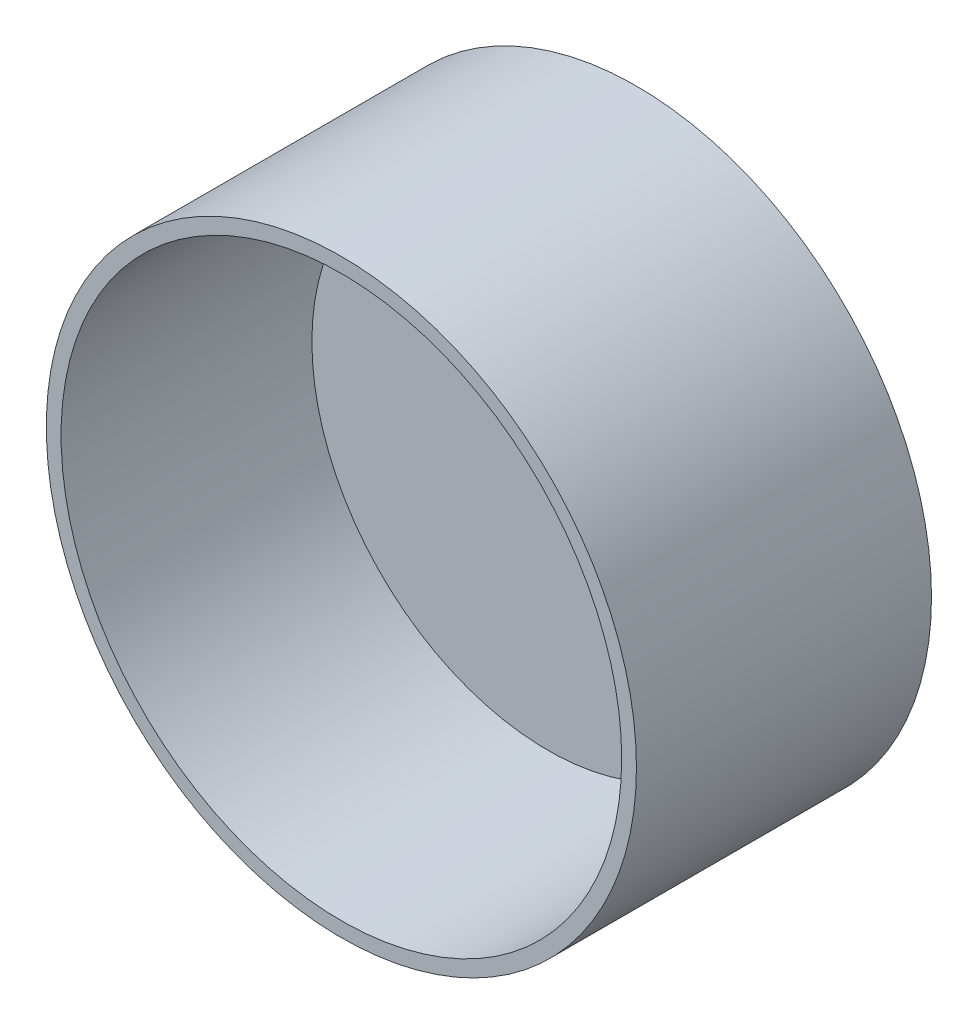
ISO-10303-21;
HEADER;
FILE_DESCRIPTION(('STEP AP214'),'2;1');
FILE_NAME('part.step','',(''),(''),'','','');
FILE_SCHEMA(('AUTOMOTIVE_DESIGN { 1 0 10303 214 1 1 1 1 }'));
ENDSEC;
DATA;
#1=APPLICATION_CONTEXT('core data for automotive mechanical design processes');
#2=APPLICATION_PROTOCOL_DEFINITION('international standard','automotive_design',2000,#1);
#3=PRODUCT_CONTEXT('',#1,'mechanical');
#4=PRODUCT('Part','Part','',(#3));
#5=PRODUCT_RELATED_PRODUCT_CATEGORY('part','',(#4));
#6=PRODUCT_DEFINITION_FORMATION('','',#4);
#7=PRODUCT_DEFINITION_CONTEXT('part definition',#1,'design');
#8=PRODUCT_DEFINITION('design','',#6,#7);
#9=PRODUCT_DEFINITION_SHAPE('','',#8);
#10=(LENGTH_UNIT() NAMED_UNIT(*) SI_UNIT(.MILLI.,.METRE.));
#11=(NAMED_UNIT(*) PLANE_ANGLE_UNIT() SI_UNIT($,.RADIAN.));
#12=(NAMED_UNIT(*) SI_UNIT($,.STERADIAN.) SOLID_ANGLE_UNIT());
#13=UNCERTAINTY_MEASURE_WITH_UNIT(LENGTH_MEASURE(1.E-05),#10,'distance_accuracy_value','');
#14=(GEOMETRIC_REPRESENTATION_CONTEXT(3) GLOBAL_UNCERTAINTY_ASSIGNED_CONTEXT((#13)) GLOBAL_UNIT_ASSIGNED_CONTEXT((#10,
#11,#12)) REPRESENTATION_CONTEXT('',''));
#15=CARTESIAN_POINT('',(0.,0.,0.));
#16=DIRECTION('',(0.,0.,1.));
#17=DIRECTION('',(1.,0.,0.));
#18=AXIS2_PLACEMENT_3D('',#15,#16,#17);
#19=CARTESIAN_POINT('',(0.,0.,30.));
#20=DIRECTION('',(0.,0.,-1.));
#21=DIRECTION('',(-1.,0.,0.));
#22=AXIS2_PLACEMENT_3D('',#19,#20,#21);
#23=CYLINDRICAL_SURFACE('',#22,80.);
#24=CARTESIAN_POINT('',(0.,0.,30.));
#25=DIRECTION('',(0.,0.,-1.));
#26=DIRECTION('',(-1.,0.,0.));
#27=AXIS2_PLACEMENT_3D('',#24,#25,#26);
#28=CIRCLE('',#27,80.);
#29=CARTESIAN_POINT('',(-80.,0.,30.));
#30=VERTEX_POINT('',#29);
#31=EDGE_CURVE('E11',#30,#30,#28,.T.);
#32=ORIENTED_EDGE('',*,*,#31,.T.);
#33=EDGE_LOOP('',(#32));
#34=FACE_BOUND('',#33,.T.);
#35=CARTESIAN_POINT('',(0.,0.,0.));
#36=DIRECTION('',(0.,0.,-1.));
#37=DIRECTION('',(-1.,0.,0.));
#38=AXIS2_PLACEMENT_3D('',#35,#36,#37);
#39=CIRCLE('',#38,80.);
#40=CARTESIAN_POINT('',(-80.,0.,0.));
#41=VERTEX_POINT('',#40);
#42=EDGE_CURVE('E49',#41,#41,#39,.T.);
#43=ORIENTED_EDGE('',*,*,#42,.F.);
#44=EDGE_LOOP('',(#43));
#45=FACE_BOUND('',#44,.T.);
#46=ADVANCED_FACE('F46',(#34,#45),#23,.T.);
#47=CARTESIAN_POINT('',(0.,0.,30.));
#48=DIRECTION('',(0.,0.,-1.));
#49=DIRECTION('',(-1.,0.,0.));
#50=AXIS2_PLACEMENT_3D('',#47,#48,#49);
#51=PLANE('',#50);
#52=ORIENTED_EDGE('',*,*,#31,.F.);
#53=EDGE_LOOP('',(#52));
#54=FACE_BOUND('',#53,.T.);
#55=ADVANCED_FACE('F61',(#54),#51,.F.);
#56=CARTESIAN_POINT('',(0.,0.,0.));
#57=DIRECTION('',(0.,0.,-1.));
#58=DIRECTION('',(-1.,0.,0.));
#59=AXIS2_PLACEMENT_3D('',#56,#57,#58);
#60=PLANE('',#59);
#61=ORIENTED_EDGE('',*,*,#42,.T.);
#62=EDGE_LOOP('',(#61));
#63=FACE_BOUND('',#62,.T.);
#64=ADVANCED_FACE('F58',(#63),#60,.T.);
#65=CLOSED_SHELL('',(#46,#55,#64));
#66=MANIFOLD_SOLID_BREP('B2',#65);
#67=CARTESIAN_POINT('',(0.,0.,100.));
#68=DIRECTION('',(0.,0.,1.));
#69=DIRECTION('',(1.,0.,0.));
#70=AXIS2_PLACEMENT_3D('',#67,#68,#69);
#71=PLANE('',#70);
#72=CARTESIAN_POINT('',(0.,0.,100.));
#73=DIRECTION('',(0.,0.,1.));
#74=DIRECTION('',(1.,0.,0.));
#75=AXIS2_PLACEMENT_3D('',#72,#73,#74);
#76=CIRCLE('',#75,100.);
#77=CARTESIAN_POINT('',(100.,0.,100.));
#78=VERTEX_POINT('',#77);
#79=EDGE_CURVE('E45',#78,#78,#76,.T.);
#80=ORIENTED_EDGE('',*,*,#79,.T.);
#81=EDGE_LOOP('',(#80));
#82=FACE_BOUND('',#81,.T.);
#83=CARTESIAN_POINT('',(0.,0.,100.));
#84=DIRECTION('',(0.,0.,1.));
#85=DIRECTION('',(1.,0.,0.));
#86=AXIS2_PLACEMENT_3D('',#83,#84,#85);
#87=CIRCLE('',#86,95.);
#88=CARTESIAN_POINT('',(95.,0.,100.));
#89=VERTEX_POINT('',#88);
#90=EDGE_CURVE('E103',#89,#89,#87,.T.);
#91=ORIENTED_EDGE('',*,*,#90,.F.);
#92=EDGE_LOOP('',(#91));
#93=FACE_BOUND('',#92,.T.);
#94=ADVANCED_FACE('F92',(#82,#93),#71,.T.);
#95=CARTESIAN_POINT('',(0.,0.,0.));
#96=DIRECTION('',(0.,0.,1.));
#97=DIRECTION('',(1.,0.,0.));
#98=AXIS2_PLACEMENT_3D('',#95,#96,#97);
#99=PLANE('',#98);
#100=CARTESIAN_POINT('',(0.,0.,0.));
#101=DIRECTION('',(0.,0.,1.));
#102=DIRECTION('',(1.,0.,0.));
#103=AXIS2_PLACEMENT_3D('',#100,#101,#102);
#104=CIRCLE('',#103,100.);
#105=CARTESIAN_POINT('',(100.,0.,0.));
#106=VERTEX_POINT('',#105);
#107=EDGE_CURVE('E96',#106,#106,#104,.T.);
#108=ORIENTED_EDGE('',*,*,#107,.F.);
#109=EDGE_LOOP('',(#108));
#110=FACE_BOUND('',#109,.T.);
#111=CARTESIAN_POINT('',(0.,0.,0.));
#112=DIRECTION('',(0.,0.,1.));
#113=DIRECTION('',(1.,0.,0.));
#114=AXIS2_PLACEMENT_3D('',#111,#112,#113);
#115=CIRCLE('',#114,95.);
#116=CARTESIAN_POINT('',(95.,0.,0.));
#117=VERTEX_POINT('',#116);
#118=EDGE_CURVE('E105',#117,#117,#115,.T.);
#119=ORIENTED_EDGE('',*,*,#118,.T.);
#120=EDGE_LOOP('',(#119));
#121=FACE_BOUND('',#120,.T.);
#122=ADVANCED_FACE('F115',(#110,#121),#99,.F.);
#123=CARTESIAN_POINT('',(0.,0.,100.));
#124=DIRECTION('',(0.,0.,-1.));
#125=DIRECTION('',(-1.,0.,0.));
#126=AXIS2_PLACEMENT_3D('',#123,#124,#125);
#127=CYLINDRICAL_SURFACE('',#126,100.);
#128=ORIENTED_EDGE('',*,*,#79,.F.);
#129=EDGE_LOOP('',(#128));
#130=FACE_BOUND('',#129,.T.);
#131=ORIENTED_EDGE('',*,*,#107,.T.);
#132=EDGE_LOOP('',(#131));
#133=FACE_BOUND('',#132,.T.);
#134=ADVANCED_FACE('F94',(#130,#133),#127,.T.);
#135=CARTESIAN_POINT('',(0.,0.,100.));
#136=DIRECTION('',(0.,0.,-1.));
#137=DIRECTION('',(-1.,0.,0.));
#138=AXIS2_PLACEMENT_3D('',#135,#136,#137);
#139=CYLINDRICAL_SURFACE('',#138,95.);
#140=ORIENTED_EDGE('',*,*,#90,.T.);
#141=EDGE_LOOP('',(#140));
#142=FACE_BOUND('',#141,.T.);
#143=ORIENTED_EDGE('',*,*,#118,.F.);
#144=EDGE_LOOP('',(#143));
#145=FACE_BOUND('',#144,.T.);
#146=ADVANCED_FACE('F111',(#142,#145),#139,.F.);
#147=CLOSED_SHELL('',(#94,#122,#134,#146));
#148=MANIFOLD_SOLID_BREP('B6',#147);
#149=ADVANCED_BREP_SHAPE_REPRESENTATION('',(#18,#66,#148),#14);
#150=SHAPE_DEFINITION_REPRESENTATION(#9,#149);
ENDSEC;
END-ISO-10303-21;
